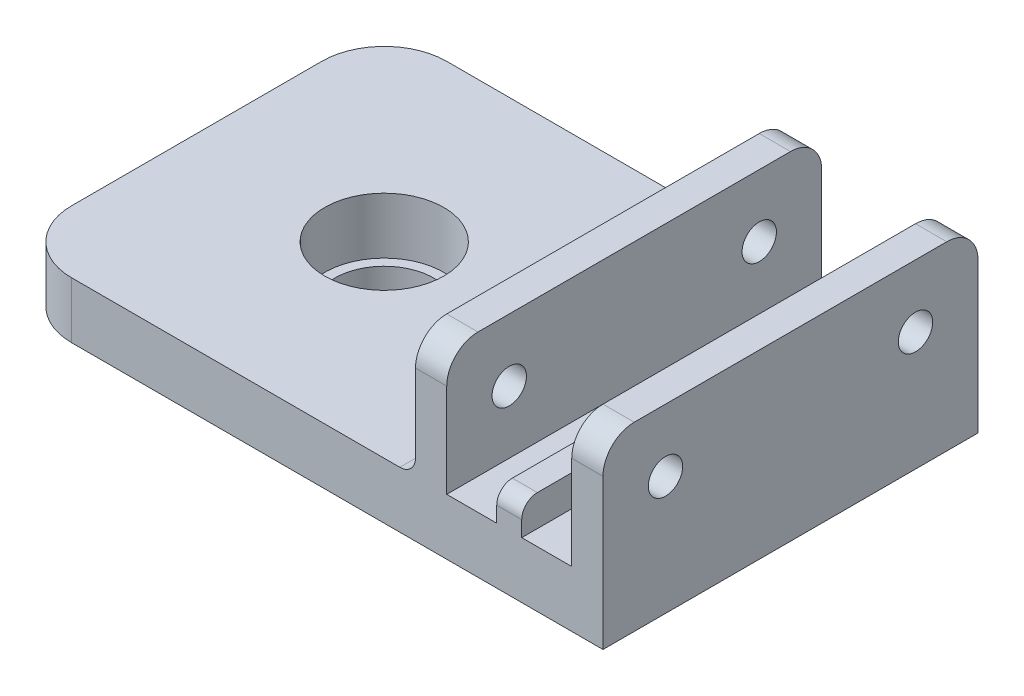
ISO-10303-21;
HEADER;
FILE_DESCRIPTION(('STEP AP214'),'2;1');
FILE_NAME('part.step','',(''),(''),'','','');
FILE_SCHEMA(('AUTOMOTIVE_DESIGN { 1 0 10303 214 1 1 1 1 }'));
ENDSEC;
DATA;
#1=APPLICATION_CONTEXT('core data for automotive mechanical design processes');
#2=APPLICATION_PROTOCOL_DEFINITION('international standard','automotive_design',2000,#1);
#3=PRODUCT_CONTEXT('',#1,'mechanical');
#4=PRODUCT('Part','Part','',(#3));
#5=PRODUCT_RELATED_PRODUCT_CATEGORY('part','',(#4));
#6=PRODUCT_DEFINITION_FORMATION('','',#4);
#7=PRODUCT_DEFINITION_CONTEXT('part definition',#1,'design');
#8=PRODUCT_DEFINITION('design','',#6,#7);
#9=PRODUCT_DEFINITION_SHAPE('','',#8);
#10=(LENGTH_UNIT() NAMED_UNIT(*) SI_UNIT(.MILLI.,.METRE.));
#11=(NAMED_UNIT(*) PLANE_ANGLE_UNIT() SI_UNIT($,.RADIAN.));
#12=(NAMED_UNIT(*) SI_UNIT($,.STERADIAN.) SOLID_ANGLE_UNIT());
#13=UNCERTAINTY_MEASURE_WITH_UNIT(LENGTH_MEASURE(1.E-05),#10,'distance_accuracy_value','');
#14=(GEOMETRIC_REPRESENTATION_CONTEXT(3) GLOBAL_UNCERTAINTY_ASSIGNED_CONTEXT((#13)) GLOBAL_UNIT_ASSIGNED_CONTEXT((#10,
#11,#12)) REPRESENTATION_CONTEXT('',''));
#15=CARTESIAN_POINT('',(0.,0.,0.));
#16=DIRECTION('',(0.,0.,1.));
#17=DIRECTION('',(1.,0.,0.));
#18=AXIS2_PLACEMENT_3D('',#15,#16,#17);
#19=CARTESIAN_POINT('',(0.,9.,0.));
#20=DIRECTION('',(0.,-1.,0.));
#21=DIRECTION('',(0.,0.,-1.));
#22=AXIS2_PLACEMENT_3D('',#19,#20,#21);
#23=PLANE('',#22);
#24=DIRECTION('',(1.,0.,0.));
#25=VECTOR('',#24,1.);
#26=CARTESIAN_POINT('',(-30.,9.,-30.));
#27=LINE('',#26,#25);
#28=CARTESIAN_POINT('',(52.,9.,-30.));
#29=VERTEX_POINT('',#28);
#30=CARTESIAN_POINT('',(60.,9.,-30.));
#31=VERTEX_POINT('',#30);
#32=EDGE_CURVE('E227',#29,#31,#27,.T.);
#33=ORIENTED_EDGE('',*,*,#32,.F.);
#34=DIRECTION('',(0.,0.,-1.));
#35=VECTOR('',#34,1.);
#36=CARTESIAN_POINT('',(52.,9.,50.6155281280883));
#37=LINE('',#36,#35);
#38=CARTESIAN_POINT('',(52.,9.,30.));
#39=VERTEX_POINT('',#38);
#40=EDGE_CURVE('E207',#39,#29,#37,.T.);
#41=ORIENTED_EDGE('',*,*,#40,.F.);
#42=DIRECTION('',(1.,0.,0.));
#43=VECTOR('',#42,1.);
#44=CARTESIAN_POINT('',(-30.,9.,30.));
#45=LINE('',#44,#43);
#46=CARTESIAN_POINT('',(60.,9.,30.));
#47=VERTEX_POINT('',#46);
#48=EDGE_CURVE('E231',#39,#47,#45,.T.);
#49=ORIENTED_EDGE('',*,*,#48,.T.);
#50=DIRECTION('',(0.,0.,-1.));
#51=VECTOR('',#50,1.);
#52=CARTESIAN_POINT('',(60.,9.,50.6155281280883));
#53=LINE('',#52,#51);
#54=EDGE_CURVE('E398',#47,#31,#53,.T.);
#55=ORIENTED_EDGE('',*,*,#54,.T.);
#56=EDGE_LOOP('',(#33,#41,#49,#55));
#57=FACE_BOUND('',#56,.T.);
#58=ADVANCED_FACE('F39',(#57),#23,.F.);
#59=CARTESIAN_POINT('',(40.,9.,30.));
#60=VERTEX_POINT('',#59);
#61=CARTESIAN_POINT('',(48.,9.,30.));
#62=VERTEX_POINT('',#61);
#63=EDGE_CURVE('E216',#60,#62,#45,.T.);
#64=ORIENTED_EDGE('',*,*,#63,.T.);
#65=DIRECTION('',(0.,0.,-1.));
#66=VECTOR('',#65,1.);
#67=CARTESIAN_POINT('',(48.,9.,50.6155281280883));
#68=LINE('',#67,#66);
#69=CARTESIAN_POINT('',(48.,9.,-30.));
#70=VERTEX_POINT('',#69);
#71=EDGE_CURVE('E199',#62,#70,#68,.T.);
#72=ORIENTED_EDGE('',*,*,#71,.T.);
#73=CARTESIAN_POINT('',(40.,9.,-30.));
#74=VERTEX_POINT('',#73);
#75=EDGE_CURVE('E214',#74,#70,#27,.T.);
#76=ORIENTED_EDGE('',*,*,#75,.F.);
#77=DIRECTION('',(0.,0.,-1.));
#78=VECTOR('',#77,1.);
#79=CARTESIAN_POINT('',(40.,9.,50.6155281280883));
#80=LINE('',#79,#78);
#81=EDGE_CURVE('E498',#60,#74,#80,.T.);
#82=ORIENTED_EDGE('',*,*,#81,.F.);
#83=EDGE_LOOP('',(#64,#72,#76,#82));
#84=FACE_BOUND('',#83,.T.);
#85=ADVANCED_FACE('F212',(#84),#23,.F.);
#86=CARTESIAN_POINT('',(-30.,9.,30.));
#87=DIRECTION('',(-1.,0.,0.));
#88=DIRECTION('',(0.,0.,1.));
#89=AXIS2_PLACEMENT_3D('',#86,#87,#88);
#90=PLANE('',#89);
#91=DIRECTION('',(0.,0.,-1.));
#92=VECTOR('',#91,1.);
#93=CARTESIAN_POINT('',(-30.,0.,30.));
#94=LINE('',#93,#92);
#95=CARTESIAN_POINT('',(-30.,0.,20.));
#96=VERTEX_POINT('',#95);
#97=CARTESIAN_POINT('',(-30.,0.,-20.));
#98=VERTEX_POINT('',#97);
#99=EDGE_CURVE('E241',#96,#98,#94,.T.);
#100=ORIENTED_EDGE('',*,*,#99,.F.);
#101=DIRECTION('',(0.,-1.,0.));
#102=VECTOR('',#101,1.);
#103=CARTESIAN_POINT('',(-30.,9.,20.));
#104=LINE('',#103,#102);
#105=CARTESIAN_POINT('',(-30.,9.,20.));
#106=VERTEX_POINT('',#105);
#107=EDGE_CURVE('E371',#96,#106,#104,.F.);
#108=ORIENTED_EDGE('',*,*,#107,.T.);
#109=DIRECTION('',(0.,0.,-1.));
#110=VECTOR('',#109,1.);
#111=CARTESIAN_POINT('',(-30.,9.,30.));
#112=LINE('',#111,#110);
#113=CARTESIAN_POINT('',(-30.,9.,-20.));
#114=VERTEX_POINT('',#113);
#115=EDGE_CURVE('E232',#106,#114,#112,.T.);
#116=ORIENTED_EDGE('',*,*,#115,.T.);
#117=DIRECTION('',(0.,-1.,0.));
#118=VECTOR('',#117,1.);
#119=CARTESIAN_POINT('',(-30.,9.,-20.));
#120=LINE('',#119,#118);
#121=EDGE_CURVE('E367',#114,#98,#120,.T.);
#122=ORIENTED_EDGE('',*,*,#121,.T.);
#123=EDGE_LOOP('',(#100,#108,#116,#122));
#124=FACE_BOUND('',#123,.T.);
#125=ADVANCED_FACE('F535',(#124),#90,.T.);
#126=CARTESIAN_POINT('',(-30.,9.,30.));
#127=DIRECTION('',(0.,0.,-1.));
#128=DIRECTION('',(-1.,0.,0.));
#129=AXIS2_PLACEMENT_3D('',#126,#127,#128);
#130=PLANE('',#129);
#131=CARTESIAN_POINT('',(-20.,9.,30.));
#132=VERTEX_POINT('',#131);
#133=CARTESIAN_POINT('',(32.5,9.,30.));
#134=VERTEX_POINT('',#133);
#135=EDGE_CURVE('E236',#132,#134,#45,.T.);
#136=ORIENTED_EDGE('',*,*,#135,.F.);
#137=DIRECTION('',(0.,-1.,0.));
#138=VECTOR('',#137,1.);
#139=CARTESIAN_POINT('',(-20.,0.,30.));
#140=LINE('',#139,#138);
#141=CARTESIAN_POINT('',(-20.,0.,30.));
#142=VERTEX_POINT('',#141);
#143=EDGE_CURVE('E357',#132,#142,#140,.T.);
#144=ORIENTED_EDGE('',*,*,#143,.T.);
#145=DIRECTION('',(1.,0.,0.));
#146=VECTOR('',#145,1.);
#147=CARTESIAN_POINT('',(-30.,0.,30.));
#148=LINE('',#147,#146);
#149=CARTESIAN_POINT('',(65.,0.,30.));
#150=VERTEX_POINT('',#149);
#151=EDGE_CURVE('E253',#142,#150,#148,.T.);
#152=ORIENTED_EDGE('',*,*,#151,.T.);
#153=DIRECTION('',(0.,-1.,0.));
#154=VECTOR('',#153,1.);
#155=CARTESIAN_POINT('',(65.,9.,30.));
#156=LINE('',#155,#154);
#157=CARTESIAN_POINT('',(65.,24.,30.));
#158=VERTEX_POINT('',#157);
#159=EDGE_CURVE('E256',#158,#150,#156,.T.);
#160=ORIENTED_EDGE('',*,*,#159,.F.);
#161=DIRECTION('',(-1.,0.,0.));
#162=VECTOR('',#161,1.);
#163=CARTESIAN_POINT('',(60.,24.,30.));
#164=LINE('',#163,#162);
#165=CARTESIAN_POINT('',(60.,24.,30.));
#166=VERTEX_POINT('',#165);
#167=EDGE_CURVE('E310',#158,#166,#164,.T.);
#168=ORIENTED_EDGE('',*,*,#167,.T.);
#169=DIRECTION('',(0.,-1.,0.));
#170=VECTOR('',#169,1.);
#171=CARTESIAN_POINT('',(60.,9.,30.));
#172=LINE('',#171,#170);
#173=EDGE_CURVE('E407',#166,#47,#172,.T.);
#174=ORIENTED_EDGE('',*,*,#173,.T.);
#175=ORIENTED_EDGE('',*,*,#48,.F.);
#176=DIRECTION('',(0.,1.,0.));
#177=VECTOR('',#176,1.);
#178=CARTESIAN_POINT('',(52.,9.,30.));
#179=LINE('',#178,#177);
#180=CARTESIAN_POINT('',(52.,11.5,30.));
#181=VERTEX_POINT('',#180);
#182=EDGE_CURVE('E495',#39,#181,#179,.T.);
#183=ORIENTED_EDGE('',*,*,#182,.T.);
#184=DIRECTION('',(-1.,0.,0.));
#185=VECTOR('',#184,1.);
#186=CARTESIAN_POINT('',(48.,11.5,30.));
#187=LINE('',#186,#185);
#188=CARTESIAN_POINT('',(48.,11.5,30.));
#189=VERTEX_POINT('',#188);
#190=EDGE_CURVE('E353',#181,#189,#187,.T.);
#191=ORIENTED_EDGE('',*,*,#190,.T.);
#192=DIRECTION('',(0.,-1.,0.));
#193=VECTOR('',#192,1.);
#194=CARTESIAN_POINT('',(48.,9.,30.));
#195=LINE('',#194,#193);
#196=EDGE_CURVE('E860',#189,#62,#195,.T.);
#197=ORIENTED_EDGE('',*,*,#196,.T.);
#198=ORIENTED_EDGE('',*,*,#63,.F.);
#199=DIRECTION('',(0.,1.,0.));
#200=VECTOR('',#199,1.);
#201=CARTESIAN_POINT('',(40.,9.,30.));
#202=LINE('',#201,#200);
#203=CARTESIAN_POINT('',(40.,24.,30.));
#204=VERTEX_POINT('',#203);
#205=EDGE_CURVE('E480',#60,#204,#202,.T.);
#206=ORIENTED_EDGE('',*,*,#205,.T.);
#207=DIRECTION('',(-1.,0.,0.));
#208=VECTOR('',#207,1.);
#209=CARTESIAN_POINT('',(35.,24.,30.));
#210=LINE('',#209,#208);
#211=CARTESIAN_POINT('',(35.,24.,30.));
#212=VERTEX_POINT('',#211);
#213=EDGE_CURVE('E306',#204,#212,#210,.T.);
#214=ORIENTED_EDGE('',*,*,#213,.T.);
#215=DIRECTION('',(0.,-1.,0.));
#216=VECTOR('',#215,1.);
#217=CARTESIAN_POINT('',(35.,9.00000000000002,30.));
#218=LINE('',#217,#216);
#219=CARTESIAN_POINT('',(35.,11.5,30.));
#220=VERTEX_POINT('',#219);
#221=EDGE_CURVE('E483',#212,#220,#218,.T.);
#222=ORIENTED_EDGE('',*,*,#221,.T.);
#223=CARTESIAN_POINT('',(32.5,11.5,30.));
#224=DIRECTION('',(0.,0.,-1.));
#225=DIRECTION('',(-1.,0.,0.));
#226=AXIS2_PLACEMENT_3D('',#223,#224,#225);
#227=CIRCLE('',#226,2.5);
#228=EDGE_CURVE('E11',#220,#134,#227,.T.);
#229=ORIENTED_EDGE('',*,*,#228,.T.);
#230=EDGE_LOOP('',(#136,#144,#152,#160,#168,#174,#175,#183,#191,#197,#198,#206,#214,#222,#229));
#231=FACE_BOUND('',#230,.T.);
#232=ADVANCED_FACE('F460',(#231),#130,.F.);
#233=CARTESIAN_POINT('',(65.,9.,-30.));
#234=DIRECTION('',(1.,0.,0.));
#235=DIRECTION('',(0.,0.,-1.));
#236=AXIS2_PLACEMENT_3D('',#233,#234,#235);
#237=PLANE('',#236);
#238=CARTESIAN_POINT('',(65.,19.,-20.));
#239=DIRECTION('',(1.,0.,0.));
#240=DIRECTION('',(0.,0.,-1.));
#241=AXIS2_PLACEMENT_3D('',#238,#239,#240);
#242=CIRCLE('',#241,2.74999999999999);
#243=CARTESIAN_POINT('',(65.,19.,-22.75));
#244=VERTEX_POINT('',#243);
#245=EDGE_CURVE('E281',#244,#244,#242,.T.);
#246=ORIENTED_EDGE('',*,*,#245,.F.);
#247=EDGE_LOOP('',(#246));
#248=FACE_BOUND('',#247,.T.);
#249=CARTESIAN_POINT('',(65.,19.,20.));
#250=DIRECTION('',(1.,0.,0.));
#251=DIRECTION('',(0.,0.,-1.));
#252=AXIS2_PLACEMENT_3D('',#249,#250,#251);
#253=CIRCLE('',#252,2.74999999999999);
#254=CARTESIAN_POINT('',(65.,19.,17.25));
#255=VERTEX_POINT('',#254);
#256=EDGE_CURVE('E275',#255,#255,#253,.T.);
#257=ORIENTED_EDGE('',*,*,#256,.F.);
#258=EDGE_LOOP('',(#257));
#259=FACE_BOUND('',#258,.T.);
#260=DIRECTION('',(0.,-1.,0.));
#261=VECTOR('',#260,1.);
#262=CARTESIAN_POINT('',(65.,9.,-30.));
#263=LINE('',#262,#261);
#264=CARTESIAN_POINT('',(65.,24.,-30.));
#265=VERTEX_POINT('',#264);
#266=CARTESIAN_POINT('',(65.,0.,-30.));
#267=VERTEX_POINT('',#266);
#268=EDGE_CURVE('E240',#265,#267,#263,.T.);
#269=ORIENTED_EDGE('',*,*,#268,.F.);
#270=CARTESIAN_POINT('',(65.,24.,-25.));
#271=DIRECTION('',(1.,0.,0.));
#272=DIRECTION('',(0.,0.,-1.));
#273=AXIS2_PLACEMENT_3D('',#270,#271,#272);
#274=CIRCLE('',#273,5.);
#275=CARTESIAN_POINT('',(65.,29.,-25.));
#276=VERTEX_POINT('',#275);
#277=EDGE_CURVE('E291',#265,#276,#274,.T.);
#278=ORIENTED_EDGE('',*,*,#277,.T.);
#279=DIRECTION('',(0.,0.,-1.));
#280=VECTOR('',#279,1.);
#281=CARTESIAN_POINT('',(65.,29.,50.6155281280883));
#282=LINE('',#281,#280);
#283=CARTESIAN_POINT('',(65.,29.,25.));
#284=VERTEX_POINT('',#283);
#285=EDGE_CURVE('E411',#284,#276,#282,.T.);
#286=ORIENTED_EDGE('',*,*,#285,.F.);
#287=CARTESIAN_POINT('',(65.,24.,25.));
#288=DIRECTION('',(1.,0.,0.));
#289=DIRECTION('',(0.,0.,-1.));
#290=AXIS2_PLACEMENT_3D('',#287,#288,#289);
#291=CIRCLE('',#290,5.);
#292=EDGE_CURVE('E288',#284,#158,#291,.T.);
#293=ORIENTED_EDGE('',*,*,#292,.T.);
#294=ORIENTED_EDGE('',*,*,#159,.T.);
#295=DIRECTION('',(0.,0.,1.));
#296=VECTOR('',#295,1.);
#297=CARTESIAN_POINT('',(65.,0.,-30.));
#298=LINE('',#297,#296);
#299=EDGE_CURVE('E249',#267,#150,#298,.T.);
#300=ORIENTED_EDGE('',*,*,#299,.F.);
#301=EDGE_LOOP('',(#269,#278,#286,#293,#294,#300));
#302=FACE_BOUND('',#301,.T.);
#303=ADVANCED_FACE('F465',(#248,#259,#302),#237,.T.);
#304=CARTESIAN_POINT('',(-30.,9.,-30.));
#305=DIRECTION('',(0.,0.,-1.));
#306=DIRECTION('',(-1.,0.,0.));
#307=AXIS2_PLACEMENT_3D('',#304,#305,#306);
#308=PLANE('',#307);
#309=DIRECTION('',(1.,0.,0.));
#310=VECTOR('',#309,1.);
#311=CARTESIAN_POINT('',(-30.,0.,-30.));
#312=LINE('',#311,#310);
#313=CARTESIAN_POINT('',(-20.,0.,-30.));
#314=VERTEX_POINT('',#313);
#315=EDGE_CURVE('E245',#314,#267,#312,.T.);
#316=ORIENTED_EDGE('',*,*,#315,.F.);
#317=DIRECTION('',(0.,-1.,0.));
#318=VECTOR('',#317,1.);
#319=CARTESIAN_POINT('',(-20.,9.,-30.));
#320=LINE('',#319,#318);
#321=CARTESIAN_POINT('',(-20.,9.,-30.));
#322=VERTEX_POINT('',#321);
#323=EDGE_CURVE('E380',#314,#322,#320,.F.);
#324=ORIENTED_EDGE('',*,*,#323,.T.);
#325=CARTESIAN_POINT('',(32.5,9.,-30.));
#326=VERTEX_POINT('',#325);
#327=EDGE_CURVE('E226',#322,#326,#27,.T.);
#328=ORIENTED_EDGE('',*,*,#327,.T.);
#329=CARTESIAN_POINT('',(32.5,11.5,-30.));
#330=DIRECTION('',(0.,0.,-1.));
#331=DIRECTION('',(-1.,0.,0.));
#332=AXIS2_PLACEMENT_3D('',#329,#330,#331);
#333=CIRCLE('',#332,2.5);
#334=CARTESIAN_POINT('',(35.,11.5,-30.));
#335=VERTEX_POINT('',#334);
#336=EDGE_CURVE('E48',#326,#335,#333,.F.);
#337=ORIENTED_EDGE('',*,*,#336,.T.);
#338=DIRECTION('',(0.,1.,0.));
#339=VECTOR('',#338,1.);
#340=CARTESIAN_POINT('',(35.,9.00000000000002,-30.));
#341=LINE('',#340,#339);
#342=CARTESIAN_POINT('',(35.,24.,-30.));
#343=VERTEX_POINT('',#342);
#344=EDGE_CURVE('E494',#335,#343,#341,.T.);
#345=ORIENTED_EDGE('',*,*,#344,.T.);
#346=DIRECTION('',(1.,0.,0.));
#347=VECTOR('',#346,1.);
#348=CARTESIAN_POINT('',(-30.,23.9999999999999,-30.));
#349=LINE('',#348,#347);
#350=CARTESIAN_POINT('',(40.,24.,-30.));
#351=VERTEX_POINT('',#350);
#352=EDGE_CURVE('E260',#343,#351,#349,.T.);
#353=ORIENTED_EDGE('',*,*,#352,.T.);
#354=DIRECTION('',(0.,-1.,0.));
#355=VECTOR('',#354,1.);
#356=CARTESIAN_POINT('',(40.,9.,-30.));
#357=LINE('',#356,#355);
#358=EDGE_CURVE('E224',#351,#74,#357,.T.);
#359=ORIENTED_EDGE('',*,*,#358,.T.);
#360=ORIENTED_EDGE('',*,*,#75,.T.);
#361=DIRECTION('',(0.,1.,0.));
#362=VECTOR('',#361,1.);
#363=CARTESIAN_POINT('',(48.,9.,-30.));
#364=LINE('',#363,#362);
#365=CARTESIAN_POINT('',(48.,11.5,-30.));
#366=VERTEX_POINT('',#365);
#367=EDGE_CURVE('E194',#70,#366,#364,.T.);
#368=ORIENTED_EDGE('',*,*,#367,.T.);
#369=DIRECTION('',(1.,0.,0.));
#370=VECTOR('',#369,1.);
#371=CARTESIAN_POINT('',(-30.,11.5,-30.));
#372=LINE('',#371,#370);
#373=CARTESIAN_POINT('',(52.,11.5,-30.));
#374=VERTEX_POINT('',#373);
#375=EDGE_CURVE('E333',#366,#374,#372,.T.);
#376=ORIENTED_EDGE('',*,*,#375,.T.);
#377=DIRECTION('',(0.,-1.,0.));
#378=VECTOR('',#377,1.);
#379=CARTESIAN_POINT('',(52.,9.,-30.));
#380=LINE('',#379,#378);
#381=EDGE_CURVE('E208',#374,#29,#380,.T.);
#382=ORIENTED_EDGE('',*,*,#381,.T.);
#383=ORIENTED_EDGE('',*,*,#32,.T.);
#384=DIRECTION('',(0.,1.,0.));
#385=VECTOR('',#384,1.);
#386=CARTESIAN_POINT('',(60.,9.,-30.));
#387=LINE('',#386,#385);
#388=CARTESIAN_POINT('',(60.,24.,-30.));
#389=VERTEX_POINT('',#388);
#390=EDGE_CURVE('E409',#31,#389,#387,.T.);
#391=ORIENTED_EDGE('',*,*,#390,.T.);
#392=DIRECTION('',(1.,0.,0.));
#393=VECTOR('',#392,1.);
#394=CARTESIAN_POINT('',(-30.,24.,-30.));
#395=LINE('',#394,#393);
#396=EDGE_CURVE('E284',#389,#265,#395,.T.);
#397=ORIENTED_EDGE('',*,*,#396,.T.);
#398=ORIENTED_EDGE('',*,*,#268,.T.);
#399=EDGE_LOOP('',(#316,#324,#328,#337,#345,#353,#359,#360,#368,#376,#382,#383,#391,#397,#398));
#400=FACE_BOUND('',#399,.T.);
#401=ADVANCED_FACE('F221',(#400),#308,.T.);
#402=CARTESIAN_POINT('',(0.,9.,0.));
#403=DIRECTION('',(0.,1.,0.));
#404=DIRECTION('',(0.,0.,1.));
#405=AXIS2_PLACEMENT_3D('',#402,#403,#404);
#406=CIRCLE('',#405,9.525);
#407=CARTESIAN_POINT('',(0.,9.,9.525));
#408=VERTEX_POINT('',#407);
#409=EDGE_CURVE('E428',#408,#408,#406,.T.);
#410=ORIENTED_EDGE('',*,*,#409,.F.);
#411=EDGE_LOOP('',(#410));
#412=FACE_BOUND('',#411,.T.);
#413=ORIENTED_EDGE('',*,*,#135,.T.);
#414=DIRECTION('',(0.,0.,-1.));
#415=VECTOR('',#414,1.);
#416=CARTESIAN_POINT('',(32.5,9.,0.));
#417=LINE('',#416,#415);
#418=EDGE_CURVE('E383',#134,#326,#417,.T.);
#419=ORIENTED_EDGE('',*,*,#418,.T.);
#420=ORIENTED_EDGE('',*,*,#327,.F.);
#421=CARTESIAN_POINT('',(-20.,9.,-20.));
#422=DIRECTION('',(0.,-1.,0.));
#423=DIRECTION('',(0.,0.,-1.));
#424=AXIS2_PLACEMENT_3D('',#421,#422,#423);
#425=CIRCLE('',#424,10.);
#426=EDGE_CURVE('E374',#322,#114,#425,.F.);
#427=ORIENTED_EDGE('',*,*,#426,.T.);
#428=ORIENTED_EDGE('',*,*,#115,.F.);
#429=CARTESIAN_POINT('',(-20.,9.,20.));
#430=DIRECTION('',(0.,-1.,0.));
#431=DIRECTION('',(0.,0.,-1.));
#432=AXIS2_PLACEMENT_3D('',#429,#430,#431);
#433=CIRCLE('',#432,10.);
#434=EDGE_CURVE('E377',#106,#132,#433,.F.);
#435=ORIENTED_EDGE('',*,*,#434,.T.);
#436=EDGE_LOOP('',(#413,#419,#420,#427,#428,#435));
#437=FACE_BOUND('',#436,.T.);
#438=ADVANCED_FACE('F453',(#412,#437),#23,.F.);
#439=CARTESIAN_POINT('',(0.,0.,0.));
#440=DIRECTION('',(0.,-1.,0.));
#441=DIRECTION('',(0.,0.,-1.));
#442=AXIS2_PLACEMENT_3D('',#439,#440,#441);
#443=PLANE('',#442);
#444=CARTESIAN_POINT('',(0.,0.,0.));
#445=DIRECTION('',(0.,-1.,0.));
#446=DIRECTION('',(0.,0.,-1.));
#447=AXIS2_PLACEMENT_3D('',#444,#445,#446);
#448=CIRCLE('',#447,17.5);
#449=CARTESIAN_POINT('',(0.,0.,-17.5));
#450=VERTEX_POINT('',#449);
#451=EDGE_CURVE('E441',#450,#450,#448,.T.);
#452=ORIENTED_EDGE('',*,*,#451,.F.);
#453=EDGE_LOOP('',(#452));
#454=FACE_BOUND('',#453,.T.);
#455=ORIENTED_EDGE('',*,*,#151,.F.);
#456=CARTESIAN_POINT('',(-20.,0.,20.));
#457=DIRECTION('',(0.,-1.,0.));
#458=DIRECTION('',(0.,0.,-1.));
#459=AXIS2_PLACEMENT_3D('',#456,#457,#458);
#460=CIRCLE('',#459,10.);
#461=EDGE_CURVE('E364',#142,#96,#460,.T.);
#462=ORIENTED_EDGE('',*,*,#461,.T.);
#463=ORIENTED_EDGE('',*,*,#99,.T.);
#464=CARTESIAN_POINT('',(-20.,0.,-20.));
#465=DIRECTION('',(0.,-1.,0.));
#466=DIRECTION('',(0.,0.,-1.));
#467=AXIS2_PLACEMENT_3D('',#464,#465,#466);
#468=CIRCLE('',#467,10.);
#469=EDGE_CURVE('E361',#98,#314,#468,.T.);
#470=ORIENTED_EDGE('',*,*,#469,.T.);
#471=ORIENTED_EDGE('',*,*,#315,.T.);
#472=ORIENTED_EDGE('',*,*,#299,.T.);
#473=EDGE_LOOP('',(#455,#462,#463,#470,#471,#472));
#474=FACE_BOUND('',#473,.T.);
#475=ADVANCED_FACE('F450',(#454,#474),#443,.T.);
#476=CARTESIAN_POINT('',(0.,-10.,0.));
#477=DIRECTION('',(0.,1.,0.));
#478=DIRECTION('',(0.,0.,1.));
#479=AXIS2_PLACEMENT_3D('',#476,#477,#478);
#480=CYLINDRICAL_SURFACE('',#479,17.5);
#481=CARTESIAN_POINT('',(0.,-10.,0.));
#482=DIRECTION('',(0.,-1.,0.));
#483=DIRECTION('',(0.,0.,-1.));
#484=AXIS2_PLACEMENT_3D('',#481,#482,#483);
#485=CIRCLE('',#484,17.5);
#486=CARTESIAN_POINT('',(0.,-10.,-17.5));
#487=VERTEX_POINT('',#486);
#488=EDGE_CURVE('E246',#487,#487,#485,.T.);
#489=ORIENTED_EDGE('',*,*,#488,.F.);
#490=EDGE_LOOP('',(#489));
#491=FACE_BOUND('',#490,.T.);
#492=ORIENTED_EDGE('',*,*,#451,.T.);
#493=EDGE_LOOP('',(#492));
#494=FACE_BOUND('',#493,.T.);
#495=ADVANCED_FACE('F448',(#491,#494),#480,.T.);
#496=CARTESIAN_POINT('',(0.,-10.,0.));
#497=DIRECTION('',(0.,-1.,0.));
#498=DIRECTION('',(0.,0.,-1.));
#499=AXIS2_PLACEMENT_3D('',#496,#497,#498);
#500=PLANE('',#499);
#501=CARTESIAN_POINT('',(0.,-10.,0.));
#502=DIRECTION('',(0.,-1.,0.));
#503=DIRECTION('',(0.,0.,-1.));
#504=AXIS2_PLACEMENT_3D('',#501,#502,#503);
#505=CIRCLE('',#504,3.5);
#506=CARTESIAN_POINT('',(0.,-10.,-3.5));
#507=VERTEX_POINT('',#506);
#508=EDGE_CURVE('E424',#507,#507,#505,.T.);
#509=ORIENTED_EDGE('',*,*,#508,.F.);
#510=EDGE_LOOP('',(#509));
#511=FACE_BOUND('',#510,.T.);
#512=ORIENTED_EDGE('',*,*,#488,.T.);
#513=EDGE_LOOP('',(#512));
#514=FACE_BOUND('',#513,.T.);
#515=ADVANCED_FACE('F575',(#511,#514),#500,.T.);
#516=CARTESIAN_POINT('',(0.,0.,0.));
#517=DIRECTION('',(0.,1.,0.));
#518=DIRECTION('',(0.,0.,1.));
#519=AXIS2_PLACEMENT_3D('',#516,#517,#518);
#520=PLANE('',#519);
#521=CARTESIAN_POINT('',(0.,0.,0.));
#522=DIRECTION('',(0.,1.,0.));
#523=DIRECTION('',(0.,0.,1.));
#524=AXIS2_PLACEMENT_3D('',#521,#522,#523);
#525=CIRCLE('',#524,9.525);
#526=CARTESIAN_POINT('',(0.,0.,9.525));
#527=VERTEX_POINT('',#526);
#528=EDGE_CURVE('E269',#527,#527,#525,.T.);
#529=ORIENTED_EDGE('',*,*,#528,.T.);
#530=EDGE_LOOP('',(#529));
#531=FACE_BOUND('',#530,.T.);
#532=CARTESIAN_POINT('',(0.,0.,0.));
#533=DIRECTION('',(0.,1.,0.));
#534=DIRECTION('',(0.,0.,1.));
#535=AXIS2_PLACEMENT_3D('',#532,#533,#534);
#536=CIRCLE('',#535,7.9375);
#537=CARTESIAN_POINT('',(0.,0.,7.9375));
#538=VERTEX_POINT('',#537);
#539=EDGE_CURVE('E264',#538,#538,#536,.F.);
#540=ORIENTED_EDGE('',*,*,#539,.T.);
#541=EDGE_LOOP('',(#540));
#542=FACE_BOUND('',#541,.T.);
#543=ADVANCED_FACE('F565',(#531,#542),#520,.T.);
#544=CARTESIAN_POINT('',(0.,0.,0.));
#545=DIRECTION('',(0.,1.,0.));
#546=DIRECTION('',(0.,0.,1.));
#547=AXIS2_PLACEMENT_3D('',#544,#545,#546);
#548=CYLINDRICAL_SURFACE('',#547,9.525);
#549=ORIENTED_EDGE('',*,*,#528,.F.);
#550=EDGE_LOOP('',(#549));
#551=FACE_BOUND('',#550,.T.);
#552=ORIENTED_EDGE('',*,*,#409,.T.);
#553=EDGE_LOOP('',(#552));
#554=FACE_BOUND('',#553,.T.);
#555=ADVANCED_FACE('F562',(#551,#554),#548,.F.);
#556=CARTESIAN_POINT('',(0.,-5.,0.));
#557=DIRECTION('',(0.,1.,0.));
#558=DIRECTION('',(0.,0.,1.));
#559=AXIS2_PLACEMENT_3D('',#556,#557,#558);
#560=PLANE('',#559);
#561=CARTESIAN_POINT('',(0.,-5.,0.));
#562=DIRECTION('',(0.,1.,0.));
#563=DIRECTION('',(0.,0.,1.));
#564=AXIS2_PLACEMENT_3D('',#561,#562,#563);
#565=CIRCLE('',#564,3.5);
#566=CARTESIAN_POINT('',(0.,-5.,3.5));
#567=VERTEX_POINT('',#566);
#568=EDGE_CURVE('E415',#567,#567,#565,.F.);
#569=ORIENTED_EDGE('',*,*,#568,.T.);
#570=EDGE_LOOP('',(#569));
#571=FACE_BOUND('',#570,.T.);
#572=CARTESIAN_POINT('',(0.,-5.,0.));
#573=DIRECTION('',(0.,1.,0.));
#574=DIRECTION('',(0.,0.,1.));
#575=AXIS2_PLACEMENT_3D('',#572,#573,#574);
#576=CIRCLE('',#575,7.9375);
#577=CARTESIAN_POINT('',(0.,-5.,7.9375));
#578=VERTEX_POINT('',#577);
#579=EDGE_CURVE('E268',#578,#578,#576,.T.);
#580=ORIENTED_EDGE('',*,*,#579,.T.);
#581=EDGE_LOOP('',(#580));
#582=FACE_BOUND('',#581,.T.);
#583=ADVANCED_FACE('F564',(#571,#582),#560,.T.);
#584=CARTESIAN_POINT('',(0.,-5.,0.));
#585=DIRECTION('',(0.,1.,0.));
#586=DIRECTION('',(0.,0.,1.));
#587=AXIS2_PLACEMENT_3D('',#584,#585,#586);
#588=CYLINDRICAL_SURFACE('',#587,7.9375);
#589=ORIENTED_EDGE('',*,*,#579,.F.);
#590=EDGE_LOOP('',(#589));
#591=FACE_BOUND('',#590,.T.);
#592=ORIENTED_EDGE('',*,*,#539,.F.);
#593=EDGE_LOOP('',(#592));
#594=FACE_BOUND('',#593,.T.);
#595=ADVANCED_FACE('F572',(#591,#594),#588,.F.);
#596=CARTESIAN_POINT('',(0.,9.001,0.));
#597=DIRECTION('',(0.,-1.,0.));
#598=DIRECTION('',(0.,0.,-1.));
#599=AXIS2_PLACEMENT_3D('',#596,#597,#598);
#600=CYLINDRICAL_SURFACE('',#599,3.5);
#601=ORIENTED_EDGE('',*,*,#568,.F.);
#602=EDGE_LOOP('',(#601));
#603=FACE_BOUND('',#602,.T.);
#604=ORIENTED_EDGE('',*,*,#508,.T.);
#605=EDGE_LOOP('',(#604));
#606=FACE_BOUND('',#605,.T.);
#607=ADVANCED_FACE('F583',(#603,#606),#600,.F.);
#608=CARTESIAN_POINT('',(60.,9.,50.6155281280883));
#609=DIRECTION('',(-1.,0.,0.));
#610=DIRECTION('',(0.,0.,1.));
#611=AXIS2_PLACEMENT_3D('',#608,#609,#610);
#612=PLANE('',#611);
#613=CARTESIAN_POINT('',(60.,19.,-20.));
#614=DIRECTION('',(-1.,0.,0.));
#615=DIRECTION('',(0.,0.,1.));
#616=AXIS2_PLACEMENT_3D('',#613,#614,#615);
#617=CIRCLE('',#616,2.74999999999998);
#618=CARTESIAN_POINT('',(60.,19.,-17.25));
#619=VERTEX_POINT('',#618);
#620=EDGE_CURVE('E846',#619,#619,#617,.T.);
#621=ORIENTED_EDGE('',*,*,#620,.F.);
#622=EDGE_LOOP('',(#621));
#623=FACE_BOUND('',#622,.T.);
#624=CARTESIAN_POINT('',(60.,19.,20.));
#625=DIRECTION('',(-1.,0.,0.));
#626=DIRECTION('',(0.,0.,1.));
#627=AXIS2_PLACEMENT_3D('',#624,#625,#626);
#628=CIRCLE('',#627,2.74999999999998);
#629=CARTESIAN_POINT('',(60.,19.,22.75));
#630=VERTEX_POINT('',#629);
#631=EDGE_CURVE('E856',#630,#630,#628,.T.);
#632=ORIENTED_EDGE('',*,*,#631,.F.);
#633=EDGE_LOOP('',(#632));
#634=FACE_BOUND('',#633,.T.);
#635=DIRECTION('',(0.,0.,-1.));
#636=VECTOR('',#635,1.);
#637=CARTESIAN_POINT('',(60.,29.,50.6155281280883));
#638=LINE('',#637,#636);
#639=CARTESIAN_POINT('',(60.,29.,25.));
#640=VERTEX_POINT('',#639);
#641=CARTESIAN_POINT('',(60.,29.,-25.));
#642=VERTEX_POINT('',#641);
#643=EDGE_CURVE('E418',#640,#642,#638,.T.);
#644=ORIENTED_EDGE('',*,*,#643,.T.);
#645=CARTESIAN_POINT('',(60.,24.,-25.));
#646=DIRECTION('',(-1.,0.,0.));
#647=DIRECTION('',(0.,0.,1.));
#648=AXIS2_PLACEMENT_3D('',#645,#646,#647);
#649=CIRCLE('',#648,5.);
#650=EDGE_CURVE('E303',#642,#389,#649,.T.);
#651=ORIENTED_EDGE('',*,*,#650,.T.);
#652=ORIENTED_EDGE('',*,*,#390,.F.);
#653=ORIENTED_EDGE('',*,*,#54,.F.);
#654=ORIENTED_EDGE('',*,*,#173,.F.);
#655=CARTESIAN_POINT('',(60.,24.,25.));
#656=DIRECTION('',(-1.,0.,0.));
#657=DIRECTION('',(0.,0.,1.));
#658=AXIS2_PLACEMENT_3D('',#655,#656,#657);
#659=CIRCLE('',#658,5.);
#660=EDGE_CURVE('E300',#166,#640,#659,.T.);
#661=ORIENTED_EDGE('',*,*,#660,.T.);
#662=EDGE_LOOP('',(#644,#651,#652,#653,#654,#661));
#663=FACE_BOUND('',#662,.T.);
#664=ADVANCED_FACE('F406',(#623,#634,#663),#612,.T.);
#665=CARTESIAN_POINT('',(-30.,29.,50.6155281280883));
#666=DIRECTION('',(0.,1.,0.));
#667=DIRECTION('',(0.,0.,1.));
#668=AXIS2_PLACEMENT_3D('',#665,#666,#667);
#669=PLANE('',#668);
#670=ORIENTED_EDGE('',*,*,#285,.T.);
#671=DIRECTION('',(1.,0.,0.));
#672=VECTOR('',#671,1.);
#673=CARTESIAN_POINT('',(-30.,29.,-25.));
#674=LINE('',#673,#672);
#675=EDGE_CURVE('E297',#276,#642,#674,.F.);
#676=ORIENTED_EDGE('',*,*,#675,.T.);
#677=ORIENTED_EDGE('',*,*,#643,.F.);
#678=DIRECTION('',(-1.,0.,0.));
#679=VECTOR('',#678,1.);
#680=CARTESIAN_POINT('',(65.,29.,25.));
#681=LINE('',#680,#679);
#682=EDGE_CURVE('E294',#640,#284,#681,.F.);
#683=ORIENTED_EDGE('',*,*,#682,.T.);
#684=EDGE_LOOP('',(#670,#676,#677,#683));
#685=FACE_BOUND('',#684,.T.);
#686=ADVANCED_FACE('F474',(#685),#669,.T.);
#687=CARTESIAN_POINT('',(40.,9.,50.6155281280883));
#688=DIRECTION('',(1.,0.,0.));
#689=DIRECTION('',(0.,0.,-1.));
#690=AXIS2_PLACEMENT_3D('',#687,#688,#689);
#691=PLANE('',#690);
#692=CARTESIAN_POINT('',(40.,19.,-20.));
#693=DIRECTION('',(1.,0.,0.));
#694=DIRECTION('',(0.,0.,-1.));
#695=AXIS2_PLACEMENT_3D('',#692,#693,#694);
#696=CIRCLE('',#695,2.74999999999998);
#697=CARTESIAN_POINT('',(40.,19.,-22.75));
#698=VERTEX_POINT('',#697);
#699=EDGE_CURVE('E276',#698,#698,#696,.T.);
#700=ORIENTED_EDGE('',*,*,#699,.F.);
#701=EDGE_LOOP('',(#700));
#702=FACE_BOUND('',#701,.T.);
#703=CARTESIAN_POINT('',(40.,19.,20.));
#704=DIRECTION('',(1.,0.,0.));
#705=DIRECTION('',(0.,0.,-1.));
#706=AXIS2_PLACEMENT_3D('',#703,#704,#705);
#707=CIRCLE('',#706,2.74999999999998);
#708=CARTESIAN_POINT('',(40.,19.,17.25));
#709=VERTEX_POINT('',#708);
#710=EDGE_CURVE('E270',#709,#709,#707,.T.);
#711=ORIENTED_EDGE('',*,*,#710,.F.);
#712=EDGE_LOOP('',(#711));
#713=FACE_BOUND('',#712,.T.);
#714=ORIENTED_EDGE('',*,*,#358,.F.);
#715=CARTESIAN_POINT('',(40.,24.,-25.));
#716=DIRECTION('',(1.,0.,0.));
#717=DIRECTION('',(0.,0.,-1.));
#718=AXIS2_PLACEMENT_3D('',#715,#716,#717);
#719=CIRCLE('',#718,5.);
#720=CARTESIAN_POINT('',(40.,29.,-25.));
#721=VERTEX_POINT('',#720);
#722=EDGE_CURVE('E317',#351,#721,#719,.T.);
#723=ORIENTED_EDGE('',*,*,#722,.T.);
#724=DIRECTION('',(0.,0.,-1.));
#725=VECTOR('',#724,1.);
#726=CARTESIAN_POINT('',(40.,29.,50.6155281280883));
#727=LINE('',#726,#725);
#728=CARTESIAN_POINT('',(40.,29.,25.));
#729=VERTEX_POINT('',#728);
#730=EDGE_CURVE('E488',#729,#721,#727,.T.);
#731=ORIENTED_EDGE('',*,*,#730,.F.);
#732=CARTESIAN_POINT('',(40.,24.,25.));
#733=DIRECTION('',(1.,0.,0.));
#734=DIRECTION('',(0.,0.,-1.));
#735=AXIS2_PLACEMENT_3D('',#732,#733,#734);
#736=CIRCLE('',#735,5.);
#737=EDGE_CURVE('E314',#729,#204,#736,.T.);
#738=ORIENTED_EDGE('',*,*,#737,.T.);
#739=ORIENTED_EDGE('',*,*,#205,.F.);
#740=ORIENTED_EDGE('',*,*,#81,.T.);
#741=EDGE_LOOP('',(#714,#723,#731,#738,#739,#740));
#742=FACE_BOUND('',#741,.T.);
#743=ADVANCED_FACE('F508',(#702,#713,#742),#691,.T.);
#744=CARTESIAN_POINT('',(-30.,28.9999999999999,50.6155281280883));
#745=DIRECTION('',(0.,1.,0.));
#746=DIRECTION('',(-1.,0.,0.));
#747=AXIS2_PLACEMENT_3D('',#744,#745,#746);
#748=PLANE('',#747);
#749=ORIENTED_EDGE('',*,*,#730,.T.);
#750=DIRECTION('',(1.,0.,0.));
#751=VECTOR('',#750,1.);
#752=CARTESIAN_POINT('',(-30.,28.9999999999999,-25.));
#753=LINE('',#752,#751);
#754=CARTESIAN_POINT('',(35.,29.,-25.));
#755=VERTEX_POINT('',#754);
#756=EDGE_CURVE('E323',#721,#755,#753,.F.);
#757=ORIENTED_EDGE('',*,*,#756,.T.);
#758=DIRECTION('',(0.,0.,-1.));
#759=VECTOR('',#758,1.);
#760=CARTESIAN_POINT('',(35.,29.,50.6155281280883));
#761=LINE('',#760,#759);
#762=CARTESIAN_POINT('',(35.,29.,25.));
#763=VERTEX_POINT('',#762);
#764=EDGE_CURVE('E502',#763,#755,#761,.T.);
#765=ORIENTED_EDGE('',*,*,#764,.F.);
#766=DIRECTION('',(-1.,0.,0.));
#767=VECTOR('',#766,1.);
#768=CARTESIAN_POINT('',(40.,29.,25.));
#769=LINE('',#768,#767);
#770=EDGE_CURVE('E320',#763,#729,#769,.F.);
#771=ORIENTED_EDGE('',*,*,#770,.T.);
#772=EDGE_LOOP('',(#749,#757,#765,#771));
#773=FACE_BOUND('',#772,.T.);
#774=ADVANCED_FACE('F519',(#773),#748,.T.);
#775=CARTESIAN_POINT('',(35.,9.00000000000002,50.6155281280883));
#776=DIRECTION('',(-1.,0.,0.));
#777=DIRECTION('',(0.,-1.,0.));
#778=AXIS2_PLACEMENT_3D('',#775,#776,#777);
#779=PLANE('',#778);
#780=CARTESIAN_POINT('',(35.,19.,-20.));
#781=DIRECTION('',(-1.,0.,0.));
#782=DIRECTION('',(0.,-1.,0.));
#783=AXIS2_PLACEMENT_3D('',#780,#781,#782);
#784=CIRCLE('',#783,2.74999999999998);
#785=CARTESIAN_POINT('',(35.,16.25,-20.));
#786=VERTEX_POINT('',#785);
#787=EDGE_CURVE('E280',#786,#786,#784,.T.);
#788=ORIENTED_EDGE('',*,*,#787,.F.);
#789=EDGE_LOOP('',(#788));
#790=FACE_BOUND('',#789,.T.);
#791=CARTESIAN_POINT('',(35.,19.,20.));
#792=DIRECTION('',(-1.,0.,0.));
#793=DIRECTION('',(0.,-1.,0.));
#794=AXIS2_PLACEMENT_3D('',#791,#792,#793);
#795=CIRCLE('',#794,2.74999999999998);
#796=CARTESIAN_POINT('',(35.,16.25,20.));
#797=VERTEX_POINT('',#796);
#798=EDGE_CURVE('E274',#797,#797,#795,.T.);
#799=ORIENTED_EDGE('',*,*,#798,.F.);
#800=EDGE_LOOP('',(#799));
#801=FACE_BOUND('',#800,.T.);
#802=ORIENTED_EDGE('',*,*,#344,.F.);
#803=DIRECTION('',(0.,0.,-1.));
#804=VECTOR('',#803,1.);
#805=CARTESIAN_POINT('',(35.,11.5,50.6155281280883));
#806=LINE('',#805,#804);
#807=EDGE_CURVE('E55',#335,#220,#806,.F.);
#808=ORIENTED_EDGE('',*,*,#807,.T.);
#809=ORIENTED_EDGE('',*,*,#221,.F.);
#810=CARTESIAN_POINT('',(35.,24.,25.));
#811=DIRECTION('',(-1.,0.,0.));
#812=DIRECTION('',(0.,-1.,0.));
#813=AXIS2_PLACEMENT_3D('',#810,#811,#812);
#814=CIRCLE('',#813,5.);
#815=EDGE_CURVE('E326',#212,#763,#814,.T.);
#816=ORIENTED_EDGE('',*,*,#815,.T.);
#817=ORIENTED_EDGE('',*,*,#764,.T.);
#818=CARTESIAN_POINT('',(35.,24.,-25.));
#819=DIRECTION('',(-1.,0.,0.));
#820=DIRECTION('',(0.,-1.,0.));
#821=AXIS2_PLACEMENT_3D('',#818,#819,#820);
#822=CIRCLE('',#821,5.);
#823=EDGE_CURVE('E329',#755,#343,#822,.T.);
#824=ORIENTED_EDGE('',*,*,#823,.T.);
#825=EDGE_LOOP('',(#802,#808,#809,#816,#817,#824));
#826=FACE_BOUND('',#825,.T.);
#827=ADVANCED_FACE('F515',(#790,#801,#826),#779,.T.);
#828=CARTESIAN_POINT('',(52.,9.,50.6155281280883));
#829=DIRECTION('',(1.,0.,0.));
#830=DIRECTION('',(0.,0.,-1.));
#831=AXIS2_PLACEMENT_3D('',#828,#829,#830);
#832=PLANE('',#831);
#833=ORIENTED_EDGE('',*,*,#381,.F.);
#834=CARTESIAN_POINT('',(52.,11.5,-27.5));
#835=DIRECTION('',(1.,0.,0.));
#836=DIRECTION('',(0.,0.,-1.));
#837=AXIS2_PLACEMENT_3D('',#834,#835,#836);
#838=CIRCLE('',#837,2.5);
#839=CARTESIAN_POINT('',(52.,14.,-27.5));
#840=VERTEX_POINT('',#839);
#841=EDGE_CURVE('E339',#374,#840,#838,.T.);
#842=ORIENTED_EDGE('',*,*,#841,.T.);
#843=DIRECTION('',(0.,0.,-1.));
#844=VECTOR('',#843,1.);
#845=CARTESIAN_POINT('',(52.,14.,50.6155281280883));
#846=LINE('',#845,#844);
#847=CARTESIAN_POINT('',(52.,14.,27.5));
#848=VERTEX_POINT('',#847);
#849=EDGE_CURVE('E863',#848,#840,#846,.T.);
#850=ORIENTED_EDGE('',*,*,#849,.F.);
#851=CARTESIAN_POINT('',(52.,11.5,27.5));
#852=DIRECTION('',(1.,0.,0.));
#853=DIRECTION('',(0.,0.,-1.));
#854=AXIS2_PLACEMENT_3D('',#851,#852,#853);
#855=CIRCLE('',#854,2.5);
#856=EDGE_CURVE('E336',#848,#181,#855,.T.);
#857=ORIENTED_EDGE('',*,*,#856,.T.);
#858=ORIENTED_EDGE('',*,*,#182,.F.);
#859=ORIENTED_EDGE('',*,*,#40,.T.);
#860=EDGE_LOOP('',(#833,#842,#850,#857,#858,#859));
#861=FACE_BOUND('',#860,.T.);
#862=ADVANCED_FACE('F658',(#861),#832,.T.);
#863=CARTESIAN_POINT('',(-30.,14.,50.6155281280883));
#864=DIRECTION('',(0.,1.,0.));
#865=DIRECTION('',(0.,0.,1.));
#866=AXIS2_PLACEMENT_3D('',#863,#864,#865);
#867=PLANE('',#866);
#868=ORIENTED_EDGE('',*,*,#849,.T.);
#869=DIRECTION('',(1.,0.,0.));
#870=VECTOR('',#869,1.);
#871=CARTESIAN_POINT('',(-30.,14.,-27.5));
#872=LINE('',#871,#870);
#873=CARTESIAN_POINT('',(48.,14.,-27.5));
#874=VERTEX_POINT('',#873);
#875=EDGE_CURVE('E345',#840,#874,#872,.F.);
#876=ORIENTED_EDGE('',*,*,#875,.T.);
#877=DIRECTION('',(0.,0.,-1.));
#878=VECTOR('',#877,1.);
#879=CARTESIAN_POINT('',(48.,14.,50.6155281280883));
#880=LINE('',#879,#878);
#881=CARTESIAN_POINT('',(48.,14.,27.5));
#882=VERTEX_POINT('',#881);
#883=EDGE_CURVE('E218',#882,#874,#880,.T.);
#884=ORIENTED_EDGE('',*,*,#883,.F.);
#885=DIRECTION('',(-1.,0.,0.));
#886=VECTOR('',#885,1.);
#887=CARTESIAN_POINT('',(52.,14.,27.5));
#888=LINE('',#887,#886);
#889=EDGE_CURVE('E342',#882,#848,#888,.F.);
#890=ORIENTED_EDGE('',*,*,#889,.T.);
#891=EDGE_LOOP('',(#868,#876,#884,#890));
#892=FACE_BOUND('',#891,.T.);
#893=ADVANCED_FACE('F667',(#892),#867,.T.);
#894=CARTESIAN_POINT('',(48.,9.,50.6155281280883));
#895=DIRECTION('',(-1.,0.,0.));
#896=DIRECTION('',(0.,0.,1.));
#897=AXIS2_PLACEMENT_3D('',#894,#895,#896);
#898=PLANE('',#897);
#899=ORIENTED_EDGE('',*,*,#883,.T.);
#900=CARTESIAN_POINT('',(48.,11.5,-27.5));
#901=DIRECTION('',(-1.,0.,0.));
#902=DIRECTION('',(0.,0.,1.));
#903=AXIS2_PLACEMENT_3D('',#900,#901,#902);
#904=CIRCLE('',#903,2.5);
#905=EDGE_CURVE('E202',#874,#366,#904,.T.);
#906=ORIENTED_EDGE('',*,*,#905,.T.);
#907=ORIENTED_EDGE('',*,*,#367,.F.);
#908=ORIENTED_EDGE('',*,*,#71,.F.);
#909=ORIENTED_EDGE('',*,*,#196,.F.);
#910=CARTESIAN_POINT('',(48.,11.5,27.5));
#911=DIRECTION('',(-1.,0.,0.));
#912=DIRECTION('',(0.,0.,1.));
#913=AXIS2_PLACEMENT_3D('',#910,#911,#912);
#914=CIRCLE('',#913,2.5);
#915=EDGE_CURVE('E348',#189,#882,#914,.T.);
#916=ORIENTED_EDGE('',*,*,#915,.T.);
#917=EDGE_LOOP('',(#899,#906,#907,#908,#909,#916));
#918=FACE_BOUND('',#917,.T.);
#919=ADVANCED_FACE('F197',(#918),#898,.T.);
#920=CARTESIAN_POINT('',(65.,19.,20.));
#921=DIRECTION('',(1.,0.,0.));
#922=DIRECTION('',(0.,0.,-1.));
#923=AXIS2_PLACEMENT_3D('',#920,#921,#922);
#924=CYLINDRICAL_SURFACE('',#923,2.74999999999998);
#925=ORIENTED_EDGE('',*,*,#798,.T.);
#926=EDGE_LOOP('',(#925));
#927=FACE_BOUND('',#926,.T.);
#928=ORIENTED_EDGE('',*,*,#710,.T.);
#929=EDGE_LOOP('',(#928));
#930=FACE_BOUND('',#929,.T.);
#931=ADVANCED_FACE('F683',(#927,#930),#924,.F.);
#932=ORIENTED_EDGE('',*,*,#631,.T.);
#933=EDGE_LOOP('',(#932));
#934=FACE_BOUND('',#933,.T.);
#935=ORIENTED_EDGE('',*,*,#256,.T.);
#936=EDGE_LOOP('',(#935));
#937=FACE_BOUND('',#936,.T.);
#938=ADVANCED_FACE('F691',(#934,#937),#924,.F.);
#939=CARTESIAN_POINT('',(65.,19.,-20.));
#940=DIRECTION('',(1.,0.,0.));
#941=DIRECTION('',(0.,0.,-1.));
#942=AXIS2_PLACEMENT_3D('',#939,#940,#941);
#943=CYLINDRICAL_SURFACE('',#942,2.74999999999998);
#944=ORIENTED_EDGE('',*,*,#787,.T.);
#945=EDGE_LOOP('',(#944));
#946=FACE_BOUND('',#945,.T.);
#947=ORIENTED_EDGE('',*,*,#699,.T.);
#948=EDGE_LOOP('',(#947));
#949=FACE_BOUND('',#948,.T.);
#950=ADVANCED_FACE('F700',(#946,#949),#943,.F.);
#951=ORIENTED_EDGE('',*,*,#620,.T.);
#952=EDGE_LOOP('',(#951));
#953=FACE_BOUND('',#952,.T.);
#954=ORIENTED_EDGE('',*,*,#245,.T.);
#955=EDGE_LOOP('',(#954));
#956=FACE_BOUND('',#955,.T.);
#957=ADVANCED_FACE('F707',(#953,#956),#943,.F.);
#958=CARTESIAN_POINT('',(-30.,24.,-25.));
#959=DIRECTION('',(1.,0.,0.));
#960=DIRECTION('',(0.,0.,-1.));
#961=AXIS2_PLACEMENT_3D('',#958,#959,#960);
#962=CYLINDRICAL_SURFACE('',#961,5.);
#963=ORIENTED_EDGE('',*,*,#650,.F.);
#964=ORIENTED_EDGE('',*,*,#675,.F.);
#965=ORIENTED_EDGE('',*,*,#277,.F.);
#966=ORIENTED_EDGE('',*,*,#396,.F.);
#967=EDGE_LOOP('',(#963,#964,#965,#966));
#968=FACE_BOUND('',#967,.T.);
#969=ADVANCED_FACE('F477',(#968),#962,.T.);
#970=CARTESIAN_POINT('',(-30.,24.,25.));
#971=DIRECTION('',(1.,0.,0.));
#972=DIRECTION('',(0.,0.,-1.));
#973=AXIS2_PLACEMENT_3D('',#970,#971,#972);
#974=CYLINDRICAL_SURFACE('',#973,5.);
#975=ORIENTED_EDGE('',*,*,#292,.F.);
#976=ORIENTED_EDGE('',*,*,#682,.F.);
#977=ORIENTED_EDGE('',*,*,#660,.F.);
#978=ORIENTED_EDGE('',*,*,#167,.F.);
#979=EDGE_LOOP('',(#975,#976,#977,#978));
#980=FACE_BOUND('',#979,.T.);
#981=ADVANCED_FACE('F470',(#980),#974,.T.);
#982=CARTESIAN_POINT('',(-30.,23.9999999999999,-25.));
#983=DIRECTION('',(1.,0.,0.));
#984=DIRECTION('',(0.,1.,0.));
#985=AXIS2_PLACEMENT_3D('',#982,#983,#984);
#986=CYLINDRICAL_SURFACE('',#985,5.);
#987=ORIENTED_EDGE('',*,*,#823,.F.);
#988=ORIENTED_EDGE('',*,*,#756,.F.);
#989=ORIENTED_EDGE('',*,*,#722,.F.);
#990=ORIENTED_EDGE('',*,*,#352,.F.);
#991=EDGE_LOOP('',(#987,#988,#989,#990));
#992=FACE_BOUND('',#991,.T.);
#993=ADVANCED_FACE('F522',(#992),#986,.T.);
#994=CARTESIAN_POINT('',(-30.,23.9999999999999,25.));
#995=DIRECTION('',(1.,0.,0.));
#996=DIRECTION('',(0.,1.,0.));
#997=AXIS2_PLACEMENT_3D('',#994,#995,#996);
#998=CYLINDRICAL_SURFACE('',#997,5.);
#999=ORIENTED_EDGE('',*,*,#737,.F.);
#1000=ORIENTED_EDGE('',*,*,#770,.F.);
#1001=ORIENTED_EDGE('',*,*,#815,.F.);
#1002=ORIENTED_EDGE('',*,*,#213,.F.);
#1003=EDGE_LOOP('',(#999,#1000,#1001,#1002));
#1004=FACE_BOUND('',#1003,.T.);
#1005=ADVANCED_FACE('F513',(#1004),#998,.T.);
#1006=CARTESIAN_POINT('',(-30.,11.5,-27.5));
#1007=DIRECTION('',(1.,0.,0.));
#1008=DIRECTION('',(0.,0.,-1.));
#1009=AXIS2_PLACEMENT_3D('',#1006,#1007,#1008);
#1010=CYLINDRICAL_SURFACE('',#1009,2.5);
#1011=ORIENTED_EDGE('',*,*,#905,.F.);
#1012=ORIENTED_EDGE('',*,*,#875,.F.);
#1013=ORIENTED_EDGE('',*,*,#841,.F.);
#1014=ORIENTED_EDGE('',*,*,#375,.F.);
#1015=EDGE_LOOP('',(#1011,#1012,#1013,#1014));
#1016=FACE_BOUND('',#1015,.T.);
#1017=ADVANCED_FACE('F737',(#1016),#1010,.T.);
#1018=CARTESIAN_POINT('',(-30.,11.5,27.5));
#1019=DIRECTION('',(1.,0.,0.));
#1020=DIRECTION('',(0.,0.,-1.));
#1021=AXIS2_PLACEMENT_3D('',#1018,#1019,#1020);
#1022=CYLINDRICAL_SURFACE('',#1021,2.5);
#1023=ORIENTED_EDGE('',*,*,#856,.F.);
#1024=ORIENTED_EDGE('',*,*,#889,.F.);
#1025=ORIENTED_EDGE('',*,*,#915,.F.);
#1026=ORIENTED_EDGE('',*,*,#190,.F.);
#1027=EDGE_LOOP('',(#1023,#1024,#1025,#1026));
#1028=FACE_BOUND('',#1027,.T.);
#1029=ADVANCED_FACE('F546',(#1028),#1022,.T.);
#1030=CARTESIAN_POINT('',(-20.,9.,20.));
#1031=DIRECTION('',(0.,1.,0.));
#1032=DIRECTION('',(0.,0.,1.));
#1033=AXIS2_PLACEMENT_3D('',#1030,#1031,#1032);
#1034=CYLINDRICAL_SURFACE('',#1033,10.);
#1035=ORIENTED_EDGE('',*,*,#434,.F.);
#1036=ORIENTED_EDGE('',*,*,#107,.F.);
#1037=ORIENTED_EDGE('',*,*,#461,.F.);
#1038=ORIENTED_EDGE('',*,*,#143,.F.);
#1039=EDGE_LOOP('',(#1035,#1036,#1037,#1038));
#1040=FACE_BOUND('',#1039,.T.);
#1041=ADVANCED_FACE('F533',(#1040),#1034,.T.);
#1042=CARTESIAN_POINT('',(-20.,9.,-20.));
#1043=DIRECTION('',(0.,-1.,0.));
#1044=DIRECTION('',(0.,0.,-1.));
#1045=AXIS2_PLACEMENT_3D('',#1042,#1043,#1044);
#1046=CYLINDRICAL_SURFACE('',#1045,10.);
#1047=ORIENTED_EDGE('',*,*,#426,.F.);
#1048=ORIENTED_EDGE('',*,*,#323,.F.);
#1049=ORIENTED_EDGE('',*,*,#469,.F.);
#1050=ORIENTED_EDGE('',*,*,#121,.F.);
#1051=EDGE_LOOP('',(#1047,#1048,#1049,#1050));
#1052=FACE_BOUND('',#1051,.T.);
#1053=ADVANCED_FACE('F540',(#1052),#1046,.T.);
#1054=CARTESIAN_POINT('',(32.5,11.5,0.));
#1055=DIRECTION('',(0.,0.,-1.));
#1056=DIRECTION('',(-1.,0.,0.));
#1057=AXIS2_PLACEMENT_3D('',#1054,#1055,#1056);
#1058=CYLINDRICAL_SURFACE('',#1057,2.5);
#1059=ORIENTED_EDGE('',*,*,#228,.F.);
#1060=ORIENTED_EDGE('',*,*,#807,.F.);
#1061=ORIENTED_EDGE('',*,*,#336,.F.);
#1062=ORIENTED_EDGE('',*,*,#418,.F.);
#1063=EDGE_LOOP('',(#1059,#1060,#1061,#1062));
#1064=FACE_BOUND('',#1063,.T.);
#1065=ADVANCED_FACE('F41',(#1064),#1058,.F.);
#1066=CLOSED_SHELL('',(#58,#85,#125,#232,#303,#401,#438,#475,#495,#515,#543,#555,#583,#595,#607,
#664,#686,#743,#774,#827,#862,#893,#919,#931,#938,#950,#957,#969,#981,#993,#1005,#1017,#1029,
#1041,#1053,#1065));
#1067=MANIFOLD_SOLID_BREP('B2',#1066);
#1068=ADVANCED_BREP_SHAPE_REPRESENTATION('',(#18,#1067),#14);
#1069=SHAPE_DEFINITION_REPRESENTATION(#9,#1068);
ENDSEC;
END-ISO-10303-21;
